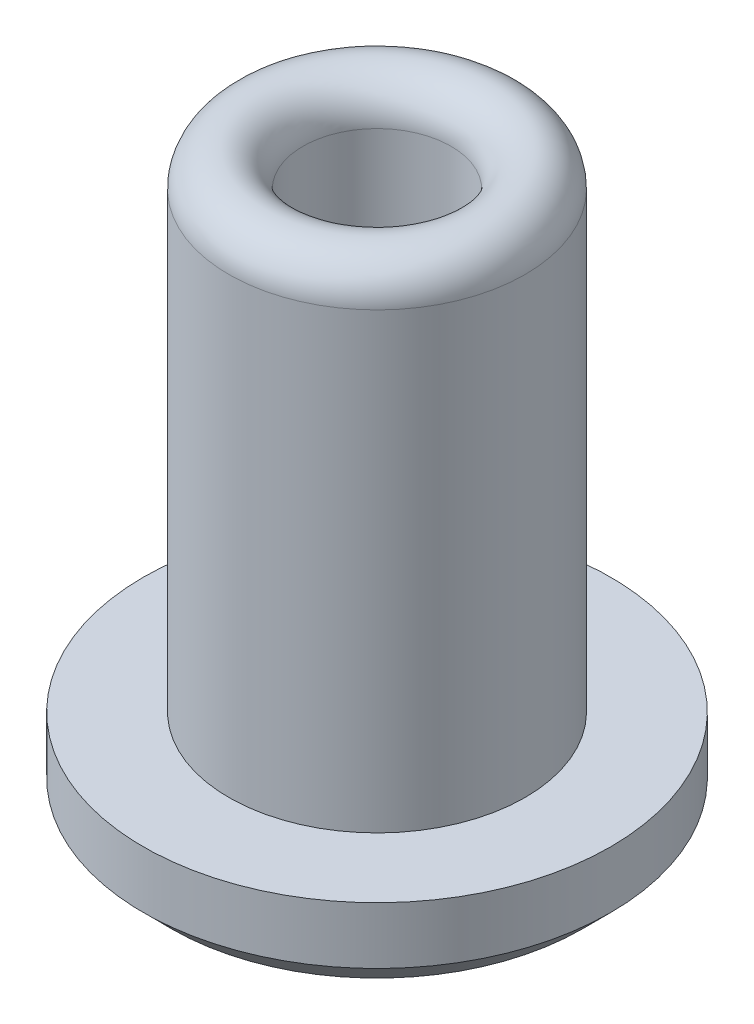
ISO-10303-21;
HEADER;
FILE_DESCRIPTION(('STEP AP214'),'2;1');
FILE_NAME('part.step','',(''),(''),'','','');
FILE_SCHEMA(('AUTOMOTIVE_DESIGN { 1 0 10303 214 1 1 1 1 }'));
ENDSEC;
DATA;
#1=APPLICATION_CONTEXT('core data for automotive mechanical design processes');
#2=APPLICATION_PROTOCOL_DEFINITION('international standard','automotive_design',2000,#1);
#3=PRODUCT_CONTEXT('',#1,'mechanical');
#4=PRODUCT('Part','Part','',(#3));
#5=PRODUCT_RELATED_PRODUCT_CATEGORY('part','',(#4));
#6=PRODUCT_DEFINITION_FORMATION('','',#4);
#7=PRODUCT_DEFINITION_CONTEXT('part definition',#1,'design');
#8=PRODUCT_DEFINITION('design','',#6,#7);
#9=PRODUCT_DEFINITION_SHAPE('','',#8);
#10=(LENGTH_UNIT() NAMED_UNIT(*) SI_UNIT(.MILLI.,.METRE.));
#11=(NAMED_UNIT(*) PLANE_ANGLE_UNIT() SI_UNIT($,.RADIAN.));
#12=(NAMED_UNIT(*) SI_UNIT($,.STERADIAN.) SOLID_ANGLE_UNIT());
#13=UNCERTAINTY_MEASURE_WITH_UNIT(LENGTH_MEASURE(1.E-05),#10,'distance_accuracy_value','');
#14=(GEOMETRIC_REPRESENTATION_CONTEXT(3) GLOBAL_UNCERTAINTY_ASSIGNED_CONTEXT((#13)) GLOBAL_UNIT_ASSIGNED_CONTEXT((#10,
#11,#12)) REPRESENTATION_CONTEXT('',''));
#15=CARTESIAN_POINT('',(0.,0.,0.));
#16=DIRECTION('',(0.,0.,1.));
#17=DIRECTION('',(1.,0.,0.));
#18=AXIS2_PLACEMENT_3D('',#15,#16,#17);
#19=CARTESIAN_POINT('',(-4.1,0.,0.));
#20=DIRECTION('',(0.,1.,0.));
#21=DIRECTION('',(-1.,0.,0.));
#22=AXIS2_PLACEMENT_3D('',#19,#20,#21);
#23=PLANE('',#22);
#24=CARTESIAN_POINT('',(0.,0.,0.));
#25=DIRECTION('',(0.,1.,0.));
#26=DIRECTION('',(-1.,0.,0.));
#27=AXIS2_PLACEMENT_3D('',#24,#25,#26);
#28=CIRCLE('',#27,3.59999999999991);
#29=CARTESIAN_POINT('',(-3.59999999999991,0.,0.));
#30=VERTEX_POINT('',#29);
#31=EDGE_CURVE('E40',#30,#30,#28,.F.);
#32=ORIENTED_EDGE('',*,*,#31,.T.);
#33=EDGE_LOOP('',(#32));
#34=FACE_BOUND('',#33,.T.);
#35=ADVANCED_FACE('F33',(#34),#23,.F.);
#36=CARTESIAN_POINT('',(-0.299999999999999,0.5,0.));
#37=DIRECTION('',(0.,-1.,0.));
#38=DIRECTION('',(1.,0.,0.));
#39=AXIS2_PLACEMENT_3D('',#36,#37,#38);
#40=PLANE('',#39);
#41=CARTESIAN_POINT('',(0.,0.499999999999945,0.));
#42=DIRECTION('',(0.,-1.,0.));
#43=DIRECTION('',(1.,0.,0.));
#44=AXIS2_PLACEMENT_3D('',#41,#42,#43);
#45=CIRCLE('',#44,0.299999999999997);
#46=CARTESIAN_POINT('',(0.299999999999995,0.499999999999946,0.));
#47=VERTEX_POINT('',#46);
#48=EDGE_CURVE('E44',#47,#47,#45,.T.);
#49=ORIENTED_EDGE('',*,*,#48,.F.);
#50=EDGE_LOOP('',(#49));
#51=FACE_BOUND('',#50,.T.);
#52=ADVANCED_FACE('F95',(#51),#40,.F.);
#53=CARTESIAN_POINT('',(0.,1.5,0.));
#54=DIRECTION('',(0.,-1.,0.));
#55=DIRECTION('',(1.,0.,0.));
#56=AXIS2_PLACEMENT_3D('',#53,#54,#55);
#57=DEGENERATE_TOROIDAL_SURFACE('',#56,0.299999999999993,1.,.T.);
#58=CARTESIAN_POINT('',(0.,1.50000000000006,0.));
#59=DIRECTION('',(0.,-1.,0.));
#60=DIRECTION('',(1.,0.,0.));
#61=AXIS2_PLACEMENT_3D('',#58,#59,#60);
#62=CIRCLE('',#61,1.29999999999999);
#63=CARTESIAN_POINT('',(1.29999999999999,1.50000000000006,0.));
#64=VERTEX_POINT('',#63);
#65=EDGE_CURVE('E48',#64,#64,#62,.T.);
#66=ORIENTED_EDGE('',*,*,#65,.F.);
#67=EDGE_LOOP('',(#66));
#68=FACE_BOUND('',#67,.T.);
#69=ORIENTED_EDGE('',*,*,#48,.T.);
#70=EDGE_LOOP('',(#69));
#71=FACE_BOUND('',#70,.T.);
#72=ADVANCED_FACE('F89',(#68,#71),#57,.F.);
#73=CARTESIAN_POINT('',(3.49148133884313E-12,-1000.,0.));
#74=DIRECTION('',(0.,-1.,0.));
#75=DIRECTION('',(1.,0.,0.));
#76=AXIS2_PLACEMENT_3D('',#73,#74,#75);
#77=CYLINDRICAL_SURFACE('',#76,1.29999999999998);
#78=CARTESIAN_POINT('',(0.,9.44999999999996,0.));
#79=DIRECTION('',(0.,-1.,0.));
#80=DIRECTION('',(1.,0.,0.));
#81=AXIS2_PLACEMENT_3D('',#78,#79,#80);
#82=CIRCLE('',#81,1.29999999999997);
#83=CARTESIAN_POINT('',(1.29999999999993,9.44999999999996,0.));
#84=VERTEX_POINT('',#83);
#85=EDGE_CURVE('E53',#84,#84,#82,.T.);
#86=ORIENTED_EDGE('',*,*,#85,.F.);
#87=EDGE_LOOP('',(#86));
#88=FACE_BOUND('',#87,.T.);
#89=ORIENTED_EDGE('',*,*,#65,.T.);
#90=EDGE_LOOP('',(#89));
#91=FACE_BOUND('',#90,.T.);
#92=ADVANCED_FACE('F83',(#88,#91),#77,.F.);
#93=CARTESIAN_POINT('',(0.,9.45,0.));
#94=DIRECTION('',(0.,-1.,0.));
#95=DIRECTION('',(1.,0.,0.));
#96=AXIS2_PLACEMENT_3D('',#93,#94,#95);
#97=TOROIDAL_SURFACE('',#96,1.94999999999997,0.65);
#98=CARTESIAN_POINT('',(0.,9.44999999999996,0.));
#99=DIRECTION('',(0.,-1.,0.));
#100=DIRECTION('',(1.,0.,0.));
#101=AXIS2_PLACEMENT_3D('',#98,#99,#100);
#102=CIRCLE('',#101,2.59999999999997);
#103=CARTESIAN_POINT('',(2.59999999999993,9.44999999999997,0.));
#104=VERTEX_POINT('',#103);
#105=EDGE_CURVE('E56',#104,#104,#102,.T.);
#106=ORIENTED_EDGE('',*,*,#105,.F.);
#107=EDGE_LOOP('',(#106));
#108=FACE_BOUND('',#107,.T.);
#109=ORIENTED_EDGE('',*,*,#85,.T.);
#110=EDGE_LOOP('',(#109));
#111=FACE_BOUND('',#110,.T.);
#112=ADVANCED_FACE('F77',(#108,#111),#97,.T.);
#113=CARTESIAN_POINT('',(3.49148133884313E-12,-1000.,0.));
#114=DIRECTION('',(0.,-1.,0.));
#115=DIRECTION('',(1.,0.,0.));
#116=AXIS2_PLACEMENT_3D('',#113,#114,#115);
#117=CYLINDRICAL_SURFACE('',#116,2.59999999999998);
#118=CARTESIAN_POINT('',(0.,1.50000000000006,0.));
#119=DIRECTION('',(0.,-1.,0.));
#120=DIRECTION('',(1.,0.,0.));
#121=AXIS2_PLACEMENT_3D('',#118,#119,#120);
#122=CIRCLE('',#121,2.59999999999999);
#123=CARTESIAN_POINT('',(2.59999999999999,1.50000000000007,0.));
#124=VERTEX_POINT('',#123);
#125=EDGE_CURVE('E59',#124,#124,#122,.T.);
#126=ORIENTED_EDGE('',*,*,#125,.F.);
#127=EDGE_LOOP('',(#126));
#128=FACE_BOUND('',#127,.T.);
#129=ORIENTED_EDGE('',*,*,#105,.T.);
#130=EDGE_LOOP('',(#129));
#131=FACE_BOUND('',#130,.T.);
#132=ADVANCED_FACE('F71',(#128,#131),#117,.T.);
#133=CARTESIAN_POINT('',(-2.6,1.5,0.));
#134=DIRECTION('',(0.,-1.,0.));
#135=DIRECTION('',(1.,0.,0.));
#136=AXIS2_PLACEMENT_3D('',#133,#134,#135);
#137=PLANE('',#136);
#138=CARTESIAN_POINT('',(0.,1.50000000000006,0.));
#139=DIRECTION('',(0.,-1.,0.));
#140=DIRECTION('',(1.,0.,0.));
#141=AXIS2_PLACEMENT_3D('',#138,#139,#140);
#142=CIRCLE('',#141,4.09999999999999);
#143=CARTESIAN_POINT('',(4.09999999999999,1.50000000000007,0.));
#144=VERTEX_POINT('',#143);
#145=EDGE_CURVE('E62',#144,#144,#142,.T.);
#146=ORIENTED_EDGE('',*,*,#145,.F.);
#147=EDGE_LOOP('',(#146));
#148=FACE_BOUND('',#147,.T.);
#149=ORIENTED_EDGE('',*,*,#125,.T.);
#150=EDGE_LOOP('',(#149));
#151=FACE_BOUND('',#150,.T.);
#152=ADVANCED_FACE('F68',(#148,#151),#137,.F.);
#153=CARTESIAN_POINT('',(3.49148133884313E-12,-1000.,0.));
#154=DIRECTION('',(0.,-1.,0.));
#155=DIRECTION('',(1.,0.,0.));
#156=AXIS2_PLACEMENT_3D('',#153,#154,#155);
#157=CYLINDRICAL_SURFACE('',#156,4.1);
#158=CARTESIAN_POINT('',(0.,0.500000000000167,0.));
#159=DIRECTION('',(0.,1.,0.));
#160=DIRECTION('',(-1.,0.,0.));
#161=AXIS2_PLACEMENT_3D('',#158,#159,#160);
#162=CIRCLE('',#161,4.1);
#163=CARTESIAN_POINT('',(-4.1,0.500000000000153,0.));
#164=VERTEX_POINT('',#163);
#165=EDGE_CURVE('E10',#164,#164,#162,.T.);
#166=ORIENTED_EDGE('',*,*,#165,.T.);
#167=EDGE_LOOP('',(#166));
#168=FACE_BOUND('',#167,.T.);
#169=ORIENTED_EDGE('',*,*,#145,.T.);
#170=EDGE_LOOP('',(#169));
#171=FACE_BOUND('',#170,.T.);
#172=ADVANCED_FACE('F66',(#168,#171),#157,.T.);
#173=CARTESIAN_POINT('',(0.,0.,0.));
#174=DIRECTION('',(0.,1.,0.));
#175=DIRECTION('',(-1.,0.,0.));
#176=AXIS2_PLACEMENT_3D('',#173,#174,#175);
#177=CONICAL_SURFACE('',#176,3.59999999999991,0.785398163397372);
#178=ORIENTED_EDGE('',*,*,#165,.F.);
#179=EDGE_LOOP('',(#178));
#180=FACE_BOUND('',#179,.T.);
#181=ORIENTED_EDGE('',*,*,#31,.F.);
#182=EDGE_LOOP('',(#181));
#183=FACE_BOUND('',#182,.T.);
#184=ADVANCED_FACE('F35',(#180,#183),#177,.T.);
#185=CLOSED_SHELL('',(#35,#52,#72,#92,#112,#132,#152,#172,#184));
#186=MANIFOLD_SOLID_BREP('B2',#185);
#187=ADVANCED_BREP_SHAPE_REPRESENTATION('',(#18,#186),#14);
#188=SHAPE_DEFINITION_REPRESENTATION(#9,#187);
ENDSEC;
END-ISO-10303-21;
